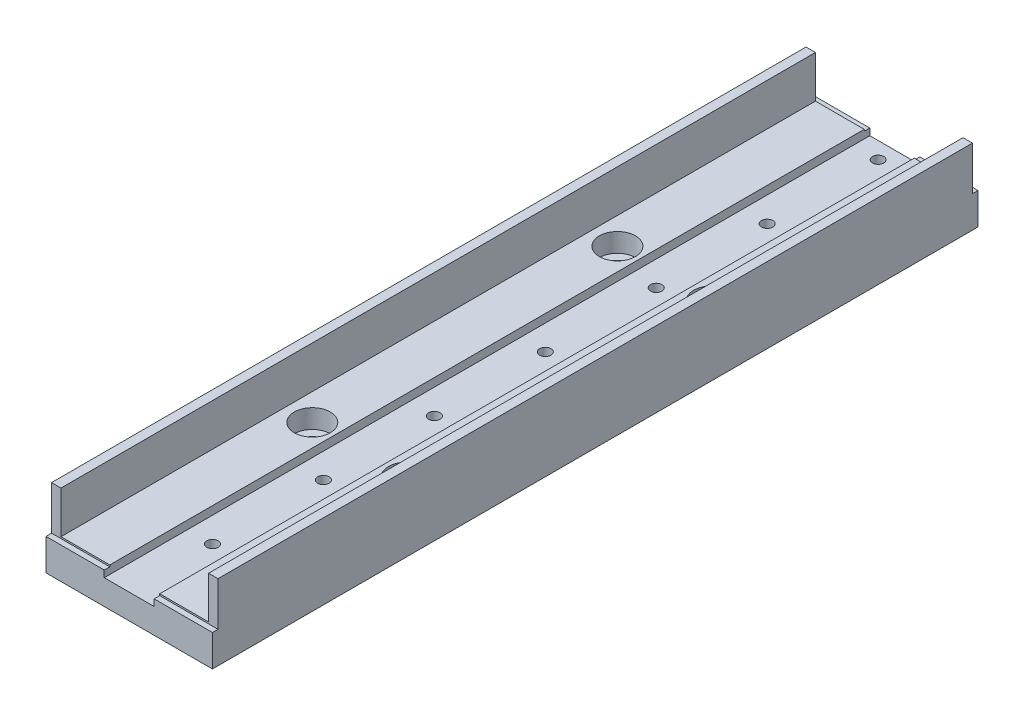
ISO-10303-21;
HEADER;
FILE_DESCRIPTION(('STEP AP214'),'2;1');
FILE_NAME('part.step','',(''),(''),'','','');
FILE_SCHEMA(('AUTOMOTIVE_DESIGN { 1 0 10303 214 1 1 1 1 }'));
ENDSEC;
DATA;
#1=APPLICATION_CONTEXT('core data for automotive mechanical design processes');
#2=APPLICATION_PROTOCOL_DEFINITION('international standard','automotive_design',2000,#1);
#3=PRODUCT_CONTEXT('',#1,'mechanical');
#4=PRODUCT('Part','Part','',(#3));
#5=PRODUCT_RELATED_PRODUCT_CATEGORY('part','',(#4));
#6=PRODUCT_DEFINITION_FORMATION('','',#4);
#7=PRODUCT_DEFINITION_CONTEXT('part definition',#1,'design');
#8=PRODUCT_DEFINITION('design','',#6,#7);
#9=PRODUCT_DEFINITION_SHAPE('','',#8);
#10=(LENGTH_UNIT() NAMED_UNIT(*) SI_UNIT(.MILLI.,.METRE.));
#11=(NAMED_UNIT(*) PLANE_ANGLE_UNIT() SI_UNIT($,.RADIAN.));
#12=(NAMED_UNIT(*) SI_UNIT($,.STERADIAN.) SOLID_ANGLE_UNIT());
#13=UNCERTAINTY_MEASURE_WITH_UNIT(LENGTH_MEASURE(1.E-05),#10,'distance_accuracy_value','');
#14=(GEOMETRIC_REPRESENTATION_CONTEXT(3) GLOBAL_UNCERTAINTY_ASSIGNED_CONTEXT((#13)) GLOBAL_UNIT_ASSIGNED_CONTEXT((#10,
#11,#12)) REPRESENTATION_CONTEXT('',''));
#15=CARTESIAN_POINT('',(0.,0.,0.));
#16=DIRECTION('',(0.,0.,1.));
#17=DIRECTION('',(1.,0.,0.));
#18=AXIS2_PLACEMENT_3D('',#15,#16,#17);
#19=CARTESIAN_POINT('',(-15.,-3.,138.));
#20=DIRECTION('',(0.,1.,0.));
#21=DIRECTION('',(0.,0.,1.));
#22=AXIS2_PLACEMENT_3D('',#19,#20,#21);
#23=PLANE('',#22);
#24=CARTESIAN_POINT('',(-8.50000000000003,-3.,96.5));
#25=DIRECTION('',(0.,1.,0.));
#26=DIRECTION('',(0.,0.,1.));
#27=AXIS2_PLACEMENT_3D('',#24,#25,#26);
#28=CIRCLE('',#27,1.7);
#29=CARTESIAN_POINT('',(-8.50000000000003,-3.,98.2));
#30=VERTEX_POINT('',#29);
#31=EDGE_CURVE('E840',#30,#30,#28,.F.);
#32=ORIENTED_EDGE('',*,*,#31,.F.);
#33=EDGE_LOOP('',(#32));
#34=FACE_BOUND('',#33,.T.);
#35=DIRECTION('',(1.,0.,0.));
#36=VECTOR('',#35,1.);
#37=CARTESIAN_POINT('',(-15.,-3.,0.));
#38=LINE('',#37,#36);
#39=CARTESIAN_POINT('',(-15.,-3.,0.));
#40=VERTEX_POINT('',#39);
#41=CARTESIAN_POINT('',(15.,-3.,0.));
#42=VERTEX_POINT('',#41);
#43=EDGE_CURVE('E226',#40,#42,#38,.T.);
#44=ORIENTED_EDGE('',*,*,#43,.T.);
#45=DIRECTION('',(0.,0.,-1.));
#46=VECTOR('',#45,1.);
#47=CARTESIAN_POINT('',(15.,-3.,138.));
#48=LINE('',#47,#46);
#49=CARTESIAN_POINT('',(15.,-3.,138.));
#50=VERTEX_POINT('',#49);
#51=EDGE_CURVE('E241',#50,#42,#48,.T.);
#52=ORIENTED_EDGE('',*,*,#51,.F.);
#53=DIRECTION('',(1.,0.,0.));
#54=VECTOR('',#53,1.);
#55=CARTESIAN_POINT('',(-15.,-3.,138.));
#56=LINE('',#55,#54);
#57=CARTESIAN_POINT('',(-15.,-3.,138.));
#58=VERTEX_POINT('',#57);
#59=EDGE_CURVE('E216',#58,#50,#56,.T.);
#60=ORIENTED_EDGE('',*,*,#59,.F.);
#61=DIRECTION('',(0.,0.,-1.));
#62=VECTOR('',#61,1.);
#63=CARTESIAN_POINT('',(-15.,-3.,138.));
#64=LINE('',#63,#62);
#65=EDGE_CURVE('E254',#58,#40,#64,.T.);
#66=ORIENTED_EDGE('',*,*,#65,.T.);
#67=EDGE_LOOP('',(#44,#52,#60,#66));
#68=FACE_BOUND('',#67,.T.);
#69=CARTESIAN_POINT('',(-8.50000000000003,-3.,41.5));
#70=DIRECTION('',(0.,1.,0.));
#71=DIRECTION('',(0.,0.,1.));
#72=AXIS2_PLACEMENT_3D('',#69,#70,#71);
#73=CIRCLE('',#72,1.7);
#74=CARTESIAN_POINT('',(-8.50000000000003,-3.,43.2));
#75=VERTEX_POINT('',#74);
#76=EDGE_CURVE('E375',#75,#75,#73,.F.);
#77=ORIENTED_EDGE('',*,*,#76,.F.);
#78=EDGE_LOOP('',(#77));
#79=FACE_BOUND('',#78,.T.);
#80=CARTESIAN_POINT('',(8.49999999999997,-3.,41.5));
#81=DIRECTION('',(0.,1.,0.));
#82=DIRECTION('',(0.,0.,1.));
#83=AXIS2_PLACEMENT_3D('',#80,#81,#82);
#84=CIRCLE('',#83,1.7);
#85=CARTESIAN_POINT('',(8.49999999999997,-3.,43.2));
#86=VERTEX_POINT('',#85);
#87=EDGE_CURVE('E862',#86,#86,#84,.F.);
#88=ORIENTED_EDGE('',*,*,#87,.F.);
#89=EDGE_LOOP('',(#88));
#90=FACE_BOUND('',#89,.T.);
#91=CARTESIAN_POINT('',(8.49999999999997,-3.,96.5));
#92=DIRECTION('',(0.,1.,0.));
#93=DIRECTION('',(0.,0.,1.));
#94=AXIS2_PLACEMENT_3D('',#91,#92,#93);
#95=CIRCLE('',#94,1.7);
#96=CARTESIAN_POINT('',(8.49999999999997,-3.,98.2));
#97=VERTEX_POINT('',#96);
#98=EDGE_CURVE('E849',#97,#97,#95,.F.);
#99=ORIENTED_EDGE('',*,*,#98,.F.);
#100=EDGE_LOOP('',(#99));
#101=FACE_BOUND('',#100,.T.);
#102=CARTESIAN_POINT('',(0.,-3.,123.));
#103=DIRECTION('',(0.,1.,0.));
#104=DIRECTION('',(0.,0.,1.));
#105=AXIS2_PLACEMENT_3D('',#102,#103,#104);
#106=CIRCLE('',#105,1.025);
#107=CARTESIAN_POINT('',(0.,-3.,124.025));
#108=VERTEX_POINT('',#107);
#109=EDGE_CURVE('E831',#108,#108,#106,.F.);
#110=ORIENTED_EDGE('',*,*,#109,.F.);
#111=EDGE_LOOP('',(#110));
#112=FACE_BOUND('',#111,.T.);
#113=CARTESIAN_POINT('',(0.,-3.,103.));
#114=DIRECTION('',(0.,1.,0.));
#115=DIRECTION('',(0.,0.,1.));
#116=AXIS2_PLACEMENT_3D('',#113,#114,#115);
#117=CIRCLE('',#116,1.025);
#118=CARTESIAN_POINT('',(0.,-3.,104.025));
#119=VERTEX_POINT('',#118);
#120=EDGE_CURVE('E824',#119,#119,#117,.F.);
#121=ORIENTED_EDGE('',*,*,#120,.F.);
#122=EDGE_LOOP('',(#121));
#123=FACE_BOUND('',#122,.T.);
#124=CARTESIAN_POINT('',(0.,-3.,83.));
#125=DIRECTION('',(0.,1.,0.));
#126=DIRECTION('',(0.,0.,1.));
#127=AXIS2_PLACEMENT_3D('',#124,#125,#126);
#128=CIRCLE('',#127,1.025);
#129=CARTESIAN_POINT('',(0.,-3.,84.025));
#130=VERTEX_POINT('',#129);
#131=EDGE_CURVE('E819',#130,#130,#128,.F.);
#132=ORIENTED_EDGE('',*,*,#131,.F.);
#133=EDGE_LOOP('',(#132));
#134=FACE_BOUND('',#133,.T.);
#135=CARTESIAN_POINT('',(0.,-3.,63.));
#136=DIRECTION('',(0.,1.,0.));
#137=DIRECTION('',(0.,0.,1.));
#138=AXIS2_PLACEMENT_3D('',#135,#136,#137);
#139=CIRCLE('',#138,1.025);
#140=CARTESIAN_POINT('',(0.,-3.,64.025));
#141=VERTEX_POINT('',#140);
#142=EDGE_CURVE('E811',#141,#141,#139,.F.);
#143=ORIENTED_EDGE('',*,*,#142,.F.);
#144=EDGE_LOOP('',(#143));
#145=FACE_BOUND('',#144,.T.);
#146=CARTESIAN_POINT('',(0.,-3.,43.));
#147=DIRECTION('',(0.,1.,0.));
#148=DIRECTION('',(0.,0.,1.));
#149=AXIS2_PLACEMENT_3D('',#146,#147,#148);
#150=CIRCLE('',#149,1.025);
#151=CARTESIAN_POINT('',(0.,-3.,44.025));
#152=VERTEX_POINT('',#151);
#153=EDGE_CURVE('E809',#152,#152,#150,.F.);
#154=ORIENTED_EDGE('',*,*,#153,.F.);
#155=EDGE_LOOP('',(#154));
#156=FACE_BOUND('',#155,.T.);
#157=CARTESIAN_POINT('',(0.,-3.,23.));
#158=DIRECTION('',(0.,1.,0.));
#159=DIRECTION('',(0.,0.,1.));
#160=AXIS2_PLACEMENT_3D('',#157,#158,#159);
#161=CIRCLE('',#160,1.025);
#162=CARTESIAN_POINT('',(0.,-3.,24.025));
#163=VERTEX_POINT('',#162);
#164=EDGE_CURVE('E802',#163,#163,#161,.F.);
#165=ORIENTED_EDGE('',*,*,#164,.F.);
#166=EDGE_LOOP('',(#165));
#167=FACE_BOUND('',#166,.T.);
#168=CARTESIAN_POINT('',(0.,-3.,3.00000000000002));
#169=DIRECTION('',(0.,1.,0.));
#170=DIRECTION('',(0.,0.,1.));
#171=AXIS2_PLACEMENT_3D('',#168,#169,#170);
#172=CIRCLE('',#171,1.025);
#173=CARTESIAN_POINT('',(0.,-3.,4.02500000000001));
#174=VERTEX_POINT('',#173);
#175=EDGE_CURVE('E791',#174,#174,#172,.F.);
#176=ORIENTED_EDGE('',*,*,#175,.F.);
#177=EDGE_LOOP('',(#176));
#178=FACE_BOUND('',#177,.T.);
#179=ADVANCED_FACE('F70',(#34,#68,#79,#90,#101,#112,#123,#134,#145,#156,#167,#178),#23,.F.);
#180=CARTESIAN_POINT('',(-4.5,1.5,138.));
#181=DIRECTION('',(0.,-1.,0.));
#182=DIRECTION('',(1.,0.,0.));
#183=AXIS2_PLACEMENT_3D('',#180,#181,#182);
#184=PLANE('',#183);
#185=CARTESIAN_POINT('',(0.,1.5,3.00000000000002));
#186=DIRECTION('',(0.,1.,0.));
#187=DIRECTION('',(0.,0.,1.));
#188=AXIS2_PLACEMENT_3D('',#185,#186,#187);
#189=CIRCLE('',#188,1.025);
#190=CARTESIAN_POINT('',(0.,1.5,4.02500000000002));
#191=VERTEX_POINT('',#190);
#192=EDGE_CURVE('E797',#191,#191,#189,.T.);
#193=ORIENTED_EDGE('',*,*,#192,.F.);
#194=EDGE_LOOP('',(#193));
#195=FACE_BOUND('',#194,.T.);
#196=CARTESIAN_POINT('',(0.,1.5,23.));
#197=DIRECTION('',(0.,1.,0.));
#198=DIRECTION('',(0.,0.,1.));
#199=AXIS2_PLACEMENT_3D('',#196,#197,#198);
#200=CIRCLE('',#199,1.025);
#201=CARTESIAN_POINT('',(0.,1.5,24.025));
#202=VERTEX_POINT('',#201);
#203=EDGE_CURVE('E799',#202,#202,#200,.T.);
#204=ORIENTED_EDGE('',*,*,#203,.F.);
#205=EDGE_LOOP('',(#204));
#206=FACE_BOUND('',#205,.T.);
#207=CARTESIAN_POINT('',(0.,1.5,43.));
#208=DIRECTION('',(0.,1.,0.));
#209=DIRECTION('',(0.,0.,1.));
#210=AXIS2_PLACEMENT_3D('',#207,#208,#209);
#211=CIRCLE('',#210,1.025);
#212=CARTESIAN_POINT('',(0.,1.5,44.025));
#213=VERTEX_POINT('',#212);
#214=EDGE_CURVE('E804',#213,#213,#211,.T.);
#215=ORIENTED_EDGE('',*,*,#214,.F.);
#216=EDGE_LOOP('',(#215));
#217=FACE_BOUND('',#216,.T.);
#218=CARTESIAN_POINT('',(0.,1.5,63.));
#219=DIRECTION('',(0.,1.,0.));
#220=DIRECTION('',(0.,0.,1.));
#221=AXIS2_PLACEMENT_3D('',#218,#219,#220);
#222=CIRCLE('',#221,1.025);
#223=CARTESIAN_POINT('',(0.,1.5,64.025));
#224=VERTEX_POINT('',#223);
#225=EDGE_CURVE('E808',#224,#224,#222,.T.);
#226=ORIENTED_EDGE('',*,*,#225,.F.);
#227=EDGE_LOOP('',(#226));
#228=FACE_BOUND('',#227,.T.);
#229=CARTESIAN_POINT('',(0.,1.5,83.));
#230=DIRECTION('',(0.,1.,0.));
#231=DIRECTION('',(0.,0.,1.));
#232=AXIS2_PLACEMENT_3D('',#229,#230,#231);
#233=CIRCLE('',#232,1.025);
#234=CARTESIAN_POINT('',(0.,1.5,84.025));
#235=VERTEX_POINT('',#234);
#236=EDGE_CURVE('E818',#235,#235,#233,.T.);
#237=ORIENTED_EDGE('',*,*,#236,.F.);
#238=EDGE_LOOP('',(#237));
#239=FACE_BOUND('',#238,.T.);
#240=CARTESIAN_POINT('',(0.,1.5,123.));
#241=DIRECTION('',(0.,1.,0.));
#242=DIRECTION('',(0.,0.,1.));
#243=AXIS2_PLACEMENT_3D('',#240,#241,#242);
#244=CIRCLE('',#243,1.025);
#245=CARTESIAN_POINT('',(0.,1.5,124.025));
#246=VERTEX_POINT('',#245);
#247=EDGE_CURVE('E828',#246,#246,#244,.T.);
#248=ORIENTED_EDGE('',*,*,#247,.F.);
#249=EDGE_LOOP('',(#248));
#250=FACE_BOUND('',#249,.T.);
#251=DIRECTION('',(-1.,0.,0.));
#252=VECTOR('',#251,1.);
#253=CARTESIAN_POINT('',(-4.5,1.5,0.));
#254=LINE('',#253,#252);
#255=CARTESIAN_POINT('',(4.5,1.5,0.));
#256=VERTEX_POINT('',#255);
#257=CARTESIAN_POINT('',(-4.5,1.5,0.));
#258=VERTEX_POINT('',#257);
#259=EDGE_CURVE('E242',#256,#258,#254,.T.);
#260=ORIENTED_EDGE('',*,*,#259,.T.);
#261=DIRECTION('',(0.,0.,-1.));
#262=VECTOR('',#261,1.);
#263=CARTESIAN_POINT('',(-4.5,1.5,138.));
#264=LINE('',#263,#262);
#265=CARTESIAN_POINT('',(-4.5,1.5,138.));
#266=VERTEX_POINT('',#265);
#267=EDGE_CURVE('E270',#266,#258,#264,.T.);
#268=ORIENTED_EDGE('',*,*,#267,.F.);
#269=DIRECTION('',(-1.,0.,0.));
#270=VECTOR('',#269,1.);
#271=CARTESIAN_POINT('',(-4.5,1.5,138.));
#272=LINE('',#271,#270);
#273=CARTESIAN_POINT('',(4.5,1.5,138.));
#274=VERTEX_POINT('',#273);
#275=EDGE_CURVE('E223',#274,#266,#272,.T.);
#276=ORIENTED_EDGE('',*,*,#275,.F.);
#277=DIRECTION('',(0.,0.,-1.));
#278=VECTOR('',#277,1.);
#279=CARTESIAN_POINT('',(4.5,1.5,138.));
#280=LINE('',#279,#278);
#281=EDGE_CURVE('E272',#274,#256,#280,.T.);
#282=ORIENTED_EDGE('',*,*,#281,.T.);
#283=EDGE_LOOP('',(#260,#268,#276,#282));
#284=FACE_BOUND('',#283,.T.);
#285=CARTESIAN_POINT('',(0.,1.5,103.));
#286=DIRECTION('',(0.,1.,0.));
#287=DIRECTION('',(0.,0.,1.));
#288=AXIS2_PLACEMENT_3D('',#285,#286,#287);
#289=CIRCLE('',#288,1.025);
#290=CARTESIAN_POINT('',(0.,1.5,104.025));
#291=VERTEX_POINT('',#290);
#292=EDGE_CURVE('E825',#291,#291,#289,.T.);
#293=ORIENTED_EDGE('',*,*,#292,.F.);
#294=EDGE_LOOP('',(#293));
#295=FACE_BOUND('',#294,.T.);
#296=ADVANCED_FACE('F306',(#195,#206,#217,#228,#239,#250,#284,#295),#184,.F.);
#297=CARTESIAN_POINT('',(15.,10.6,138.));
#298=DIRECTION('',(0.,-1.,0.));
#299=DIRECTION('',(0.,0.,-1.));
#300=AXIS2_PLACEMENT_3D('',#297,#298,#299);
#301=PLANE('',#300);
#302=DIRECTION('',(0.,0.,-1.));
#303=VECTOR('',#302,1.);
#304=CARTESIAN_POINT('',(13.3,10.6,138.));
#305=LINE('',#304,#303);
#306=CARTESIAN_POINT('',(13.3,10.6,137.));
#307=VERTEX_POINT('',#306);
#308=CARTESIAN_POINT('',(13.3,10.6,1.));
#309=VERTEX_POINT('',#308);
#310=EDGE_CURVE('E278',#307,#309,#305,.T.);
#311=ORIENTED_EDGE('',*,*,#310,.F.);
#312=DIRECTION('',(-1.,0.,0.));
#313=VECTOR('',#312,1.);
#314=CARTESIAN_POINT('',(-15.,10.6,137.));
#315=LINE('',#314,#313);
#316=CARTESIAN_POINT('',(15.,10.6,137.));
#317=VERTEX_POINT('',#316);
#318=EDGE_CURVE('E366',#317,#307,#315,.T.);
#319=ORIENTED_EDGE('',*,*,#318,.F.);
#320=DIRECTION('',(0.,0.,-1.));
#321=VECTOR('',#320,1.);
#322=CARTESIAN_POINT('',(15.,10.6,138.));
#323=LINE('',#322,#321);
#324=CARTESIAN_POINT('',(14.9999999999999,10.6,1.));
#325=VERTEX_POINT('',#324);
#326=EDGE_CURVE('E283',#317,#325,#323,.T.);
#327=ORIENTED_EDGE('',*,*,#326,.T.);
#328=DIRECTION('',(1.,0.,0.));
#329=VECTOR('',#328,1.);
#330=CARTESIAN_POINT('',(-15.,10.6,1.));
#331=LINE('',#330,#329);
#332=EDGE_CURVE('E370',#309,#325,#331,.T.);
#333=ORIENTED_EDGE('',*,*,#332,.F.);
#334=EDGE_LOOP('',(#311,#319,#327,#333));
#335=FACE_BOUND('',#334,.T.);
#336=ADVANCED_FACE('F69',(#335),#301,.F.);
#337=CARTESIAN_POINT('',(13.3,3.00000000000009,138.));
#338=DIRECTION('',(1.,0.,0.));
#339=DIRECTION('',(0.,1.,0.));
#340=AXIS2_PLACEMENT_3D('',#337,#338,#339);
#341=PLANE('',#340);
#342=DIRECTION('',(0.,0.,-1.));
#343=VECTOR('',#342,1.);
#344=CARTESIAN_POINT('',(13.3,3.00000000000009,138.));
#345=LINE('',#344,#343);
#346=CARTESIAN_POINT('',(13.3,3.00000000000009,137.));
#347=VERTEX_POINT('',#346);
#348=CARTESIAN_POINT('',(13.3,3.00000000000009,1.));
#349=VERTEX_POINT('',#348);
#350=EDGE_CURVE('E280',#347,#349,#345,.T.);
#351=ORIENTED_EDGE('',*,*,#350,.F.);
#352=DIRECTION('',(0.,1.,0.));
#353=VECTOR('',#352,1.);
#354=CARTESIAN_POINT('',(13.3,3.00000000000009,137.));
#355=LINE('',#354,#353);
#356=EDGE_CURVE('E233',#347,#307,#355,.T.);
#357=ORIENTED_EDGE('',*,*,#356,.T.);
#358=ORIENTED_EDGE('',*,*,#310,.T.);
#359=DIRECTION('',(0.,-1.,0.));
#360=VECTOR('',#359,1.);
#361=CARTESIAN_POINT('',(13.3,3.00000000000009,1.));
#362=LINE('',#361,#360);
#363=EDGE_CURVE('E338',#309,#349,#362,.T.);
#364=ORIENTED_EDGE('',*,*,#363,.T.);
#365=EDGE_LOOP('',(#351,#357,#358,#364));
#366=FACE_BOUND('',#365,.T.);
#367=ADVANCED_FACE('F363',(#366),#341,.F.);
#368=CARTESIAN_POINT('',(4.5,3.,138.));
#369=DIRECTION('',(0.,-1.,0.));
#370=DIRECTION('',(1.,0.,0.));
#371=AXIS2_PLACEMENT_3D('',#368,#369,#370);
#372=PLANE('',#371);
#373=CARTESIAN_POINT('',(8.49999999999997,3.00000000000004,96.5));
#374=DIRECTION('',(0.,1.,0.));
#375=DIRECTION('',(0.,0.,1.));
#376=AXIS2_PLACEMENT_3D('',#373,#374,#375);
#377=CIRCLE('',#376,3.25);
#378=CARTESIAN_POINT('',(8.49999999999997,3.00000000000004,99.75));
#379=VERTEX_POINT('',#378);
#380=EDGE_CURVE('E838',#379,#379,#377,.T.);
#381=ORIENTED_EDGE('',*,*,#380,.F.);
#382=EDGE_LOOP('',(#381));
#383=FACE_BOUND('',#382,.T.);
#384=CARTESIAN_POINT('',(8.49999999999997,3.00000000000004,41.5));
#385=DIRECTION('',(0.,1.,0.));
#386=DIRECTION('',(0.,0.,1.));
#387=AXIS2_PLACEMENT_3D('',#384,#385,#386);
#388=CIRCLE('',#387,3.25);
#389=CARTESIAN_POINT('',(8.49999999999997,3.00000000000004,44.75));
#390=VERTEX_POINT('',#389);
#391=EDGE_CURVE('E854',#390,#390,#388,.T.);
#392=ORIENTED_EDGE('',*,*,#391,.F.);
#393=EDGE_LOOP('',(#392));
#394=FACE_BOUND('',#393,.T.);
#395=DIRECTION('',(0.,0.,-1.));
#396=VECTOR('',#395,1.);
#397=CARTESIAN_POINT('',(4.5,3.,138.));
#398=LINE('',#397,#396);
#399=CARTESIAN_POINT('',(4.5,3.,137.));
#400=VERTEX_POINT('',#399);
#401=CARTESIAN_POINT('',(4.5,3.,1.));
#402=VERTEX_POINT('',#401);
#403=EDGE_CURVE('E274',#400,#402,#398,.T.);
#404=ORIENTED_EDGE('',*,*,#403,.F.);
#405=DIRECTION('',(1.,0.,0.));
#406=VECTOR('',#405,1.);
#407=CARTESIAN_POINT('',(4.5,3.,137.));
#408=LINE('',#407,#406);
#409=EDGE_CURVE('E355',#400,#347,#408,.T.);
#410=ORIENTED_EDGE('',*,*,#409,.T.);
#411=ORIENTED_EDGE('',*,*,#350,.T.);
#412=DIRECTION('',(-1.,0.,0.));
#413=VECTOR('',#412,1.);
#414=CARTESIAN_POINT('',(4.5,3.,1.));
#415=LINE('',#414,#413);
#416=EDGE_CURVE('E340',#349,#402,#415,.T.);
#417=ORIENTED_EDGE('',*,*,#416,.T.);
#418=EDGE_LOOP('',(#404,#410,#411,#417));
#419=FACE_BOUND('',#418,.T.);
#420=ADVANCED_FACE('F431',(#383,#394,#419),#372,.F.);
#421=CARTESIAN_POINT('',(4.5,1.5,138.));
#422=DIRECTION('',(1.,0.,0.));
#423=DIRECTION('',(0.,1.,0.));
#424=AXIS2_PLACEMENT_3D('',#421,#422,#423);
#425=PLANE('',#424);
#426=DIRECTION('',(0.,-1.,0.));
#427=VECTOR('',#426,1.);
#428=CARTESIAN_POINT('',(4.5,1.5,138.));
#429=LINE('',#428,#427);
#430=CARTESIAN_POINT('',(4.5,2.7,138.));
#431=VERTEX_POINT('',#430);
#432=EDGE_CURVE('E224',#431,#274,#429,.T.);
#433=ORIENTED_EDGE('',*,*,#432,.F.);
#434=DIRECTION('',(0.,0.,-1.));
#435=VECTOR('',#434,1.);
#436=CARTESIAN_POINT('',(4.5,2.7,138.));
#437=LINE('',#436,#435);
#438=CARTESIAN_POINT('',(4.5,2.7,137.));
#439=VERTEX_POINT('',#438);
#440=EDGE_CURVE('E89',#431,#439,#437,.T.);
#441=ORIENTED_EDGE('',*,*,#440,.T.);
#442=DIRECTION('',(0.,1.,0.));
#443=VECTOR('',#442,1.);
#444=CARTESIAN_POINT('',(4.5,1.5,137.));
#445=LINE('',#444,#443);
#446=EDGE_CURVE('E352',#439,#400,#445,.T.);
#447=ORIENTED_EDGE('',*,*,#446,.T.);
#448=ORIENTED_EDGE('',*,*,#403,.T.);
#449=DIRECTION('',(0.,-1.,0.));
#450=VECTOR('',#449,1.);
#451=CARTESIAN_POINT('',(4.5,1.5,1.));
#452=LINE('',#451,#450);
#453=CARTESIAN_POINT('',(4.5,2.7,1.));
#454=VERTEX_POINT('',#453);
#455=EDGE_CURVE('E319',#402,#454,#452,.T.);
#456=ORIENTED_EDGE('',*,*,#455,.T.);
#457=DIRECTION('',(0.,0.,-1.));
#458=VECTOR('',#457,1.);
#459=CARTESIAN_POINT('',(4.5,2.7,138.));
#460=LINE('',#459,#458);
#461=CARTESIAN_POINT('',(4.5,2.7,0.));
#462=VERTEX_POINT('',#461);
#463=EDGE_CURVE('E320',#454,#462,#460,.T.);
#464=ORIENTED_EDGE('',*,*,#463,.T.);
#465=DIRECTION('',(0.,-1.,0.));
#466=VECTOR('',#465,1.);
#467=CARTESIAN_POINT('',(4.5,1.5,0.));
#468=LINE('',#467,#466);
#469=EDGE_CURVE('E245',#462,#256,#468,.T.);
#470=ORIENTED_EDGE('',*,*,#469,.T.);
#471=ORIENTED_EDGE('',*,*,#281,.F.);
#472=EDGE_LOOP('',(#433,#441,#447,#448,#456,#464,#470,#471));
#473=FACE_BOUND('',#472,.T.);
#474=ADVANCED_FACE('F314',(#473),#425,.F.);
#475=CARTESIAN_POINT('',(-4.5,3.,138.));
#476=DIRECTION('',(-1.,0.,0.));
#477=DIRECTION('',(0.,0.,1.));
#478=AXIS2_PLACEMENT_3D('',#475,#476,#477);
#479=PLANE('',#478);
#480=DIRECTION('',(0.,-1.,0.));
#481=VECTOR('',#480,1.);
#482=CARTESIAN_POINT('',(-4.5,3.,137.));
#483=LINE('',#482,#481);
#484=CARTESIAN_POINT('',(-4.5,3.,137.));
#485=VERTEX_POINT('',#484);
#486=CARTESIAN_POINT('',(-4.5,2.7,137.));
#487=VERTEX_POINT('',#486);
#488=EDGE_CURVE('E349',#485,#487,#483,.T.);
#489=ORIENTED_EDGE('',*,*,#488,.T.);
#490=DIRECTION('',(0.,0.,1.));
#491=VECTOR('',#490,1.);
#492=CARTESIAN_POINT('',(-4.5,2.7,138.));
#493=LINE('',#492,#491);
#494=CARTESIAN_POINT('',(-4.5,2.7,138.));
#495=VERTEX_POINT('',#494);
#496=EDGE_CURVE('E322',#487,#495,#493,.T.);
#497=ORIENTED_EDGE('',*,*,#496,.T.);
#498=DIRECTION('',(0.,1.,0.));
#499=VECTOR('',#498,1.);
#500=CARTESIAN_POINT('',(-4.5,3.,138.));
#501=LINE('',#500,#499);
#502=EDGE_CURVE('E232',#266,#495,#501,.T.);
#503=ORIENTED_EDGE('',*,*,#502,.F.);
#504=ORIENTED_EDGE('',*,*,#267,.T.);
#505=DIRECTION('',(0.,1.,0.));
#506=VECTOR('',#505,1.);
#507=CARTESIAN_POINT('',(-4.5,3.,0.));
#508=LINE('',#507,#506);
#509=CARTESIAN_POINT('',(-4.5,2.7,0.));
#510=VERTEX_POINT('',#509);
#511=EDGE_CURVE('E246',#258,#510,#508,.T.);
#512=ORIENTED_EDGE('',*,*,#511,.T.);
#513=DIRECTION('',(0.,0.,1.));
#514=VECTOR('',#513,1.);
#515=CARTESIAN_POINT('',(-4.5,2.7,138.));
#516=LINE('',#515,#514);
#517=CARTESIAN_POINT('',(-4.5,2.7,1.));
#518=VERTEX_POINT('',#517);
#519=EDGE_CURVE('E297',#510,#518,#516,.T.);
#520=ORIENTED_EDGE('',*,*,#519,.T.);
#521=DIRECTION('',(0.,1.,0.));
#522=VECTOR('',#521,1.);
#523=CARTESIAN_POINT('',(-4.5,3.,1.));
#524=LINE('',#523,#522);
#525=CARTESIAN_POINT('',(-4.5,3.,1.));
#526=VERTEX_POINT('',#525);
#527=EDGE_CURVE('E331',#518,#526,#524,.T.);
#528=ORIENTED_EDGE('',*,*,#527,.T.);
#529=DIRECTION('',(0.,0.,-1.));
#530=VECTOR('',#529,1.);
#531=CARTESIAN_POINT('',(-4.5,3.,138.));
#532=LINE('',#531,#530);
#533=EDGE_CURVE('E261',#485,#526,#532,.T.);
#534=ORIENTED_EDGE('',*,*,#533,.F.);
#535=EDGE_LOOP('',(#489,#497,#503,#504,#512,#520,#528,#534));
#536=FACE_BOUND('',#535,.T.);
#537=ADVANCED_FACE('F296',(#536),#479,.F.);
#538=CARTESIAN_POINT('',(-13.3,3.,138.));
#539=DIRECTION('',(0.,-1.,0.));
#540=DIRECTION('',(0.,0.,-1.));
#541=AXIS2_PLACEMENT_3D('',#538,#539,#540);
#542=PLANE('',#541);
#543=CARTESIAN_POINT('',(-8.50000000000003,2.99999999999986,96.5));
#544=DIRECTION('',(0.,1.,0.));
#545=DIRECTION('',(0.,0.,1.));
#546=AXIS2_PLACEMENT_3D('',#543,#544,#545);
#547=CIRCLE('',#546,3.25);
#548=CARTESIAN_POINT('',(-8.50000000000003,2.99999999999986,99.75));
#549=VERTEX_POINT('',#548);
#550=EDGE_CURVE('E833',#549,#549,#547,.T.);
#551=ORIENTED_EDGE('',*,*,#550,.F.);
#552=EDGE_LOOP('',(#551));
#553=FACE_BOUND('',#552,.T.);
#554=CARTESIAN_POINT('',(-8.50000000000003,2.99999999999986,41.5));
#555=DIRECTION('',(0.,1.,0.));
#556=DIRECTION('',(0.,0.,1.));
#557=AXIS2_PLACEMENT_3D('',#554,#555,#556);
#558=CIRCLE('',#557,3.25);
#559=CARTESIAN_POINT('',(-8.50000000000003,2.99999999999986,44.75));
#560=VERTEX_POINT('',#559);
#561=EDGE_CURVE('E861',#560,#560,#558,.T.);
#562=ORIENTED_EDGE('',*,*,#561,.F.);
#563=EDGE_LOOP('',(#562));
#564=FACE_BOUND('',#563,.T.);
#565=DIRECTION('',(0.,0.,-1.));
#566=VECTOR('',#565,1.);
#567=CARTESIAN_POINT('',(-13.3,3.,138.));
#568=LINE('',#567,#566);
#569=CARTESIAN_POINT('',(-13.3,3.,137.));
#570=VERTEX_POINT('',#569);
#571=CARTESIAN_POINT('',(-13.3,3.,1.));
#572=VERTEX_POINT('',#571);
#573=EDGE_CURVE('E265',#570,#572,#568,.T.);
#574=ORIENTED_EDGE('',*,*,#573,.F.);
#575=DIRECTION('',(1.,0.,0.));
#576=VECTOR('',#575,1.);
#577=CARTESIAN_POINT('',(-13.3,3.,137.));
#578=LINE('',#577,#576);
#579=EDGE_CURVE('E347',#570,#485,#578,.T.);
#580=ORIENTED_EDGE('',*,*,#579,.T.);
#581=ORIENTED_EDGE('',*,*,#533,.T.);
#582=DIRECTION('',(-1.,0.,0.));
#583=VECTOR('',#582,1.);
#584=CARTESIAN_POINT('',(-13.3,3.,1.));
#585=LINE('',#584,#583);
#586=EDGE_CURVE('E332',#526,#572,#585,.T.);
#587=ORIENTED_EDGE('',*,*,#586,.T.);
#588=EDGE_LOOP('',(#574,#580,#581,#587));
#589=FACE_BOUND('',#588,.T.);
#590=ADVANCED_FACE('F406',(#553,#564,#589),#542,.F.);
#591=CARTESIAN_POINT('',(-13.3,3.,138.));
#592=DIRECTION('',(-1.,0.,0.));
#593=DIRECTION('',(0.,0.,1.));
#594=AXIS2_PLACEMENT_3D('',#591,#592,#593);
#595=PLANE('',#594);
#596=DIRECTION('',(0.,0.,-1.));
#597=VECTOR('',#596,1.);
#598=CARTESIAN_POINT('',(-13.3,10.6,138.));
#599=LINE('',#598,#597);
#600=CARTESIAN_POINT('',(-13.3,10.6,137.));
#601=VERTEX_POINT('',#600);
#602=CARTESIAN_POINT('',(-13.3,10.6,1.));
#603=VERTEX_POINT('',#602);
#604=EDGE_CURVE('E256',#601,#603,#599,.T.);
#605=ORIENTED_EDGE('',*,*,#604,.F.);
#606=DIRECTION('',(0.,-1.,0.));
#607=VECTOR('',#606,1.);
#608=CARTESIAN_POINT('',(-13.3,3.,137.));
#609=LINE('',#608,#607);
#610=EDGE_CURVE('E344',#601,#570,#609,.T.);
#611=ORIENTED_EDGE('',*,*,#610,.T.);
#612=ORIENTED_EDGE('',*,*,#573,.T.);
#613=DIRECTION('',(0.,1.,0.));
#614=VECTOR('',#613,1.);
#615=CARTESIAN_POINT('',(-13.3,3.,1.));
#616=LINE('',#615,#614);
#617=EDGE_CURVE('E328',#572,#603,#616,.T.);
#618=ORIENTED_EDGE('',*,*,#617,.T.);
#619=EDGE_LOOP('',(#605,#611,#612,#618));
#620=FACE_BOUND('',#619,.T.);
#621=ADVANCED_FACE('F417',(#620),#595,.F.);
#622=CARTESIAN_POINT('',(-15.,10.6,138.));
#623=DIRECTION('',(0.,-1.,0.));
#624=DIRECTION('',(0.,0.,-1.));
#625=AXIS2_PLACEMENT_3D('',#622,#623,#624);
#626=PLANE('',#625);
#627=DIRECTION('',(0.,0.,-1.));
#628=VECTOR('',#627,1.);
#629=CARTESIAN_POINT('',(-15.,10.6,138.));
#630=LINE('',#629,#628);
#631=CARTESIAN_POINT('',(-15.,10.6,137.));
#632=VERTEX_POINT('',#631);
#633=CARTESIAN_POINT('',(-15.,10.6,1.));
#634=VERTEX_POINT('',#633);
#635=EDGE_CURVE('E257',#632,#634,#630,.T.);
#636=ORIENTED_EDGE('',*,*,#635,.F.);
#637=EDGE_CURVE('E381',#601,#632,#315,.T.);
#638=ORIENTED_EDGE('',*,*,#637,.F.);
#639=ORIENTED_EDGE('',*,*,#604,.T.);
#640=EDGE_CURVE('E371',#634,#603,#331,.T.);
#641=ORIENTED_EDGE('',*,*,#640,.F.);
#642=EDGE_LOOP('',(#636,#638,#639,#641));
#643=FACE_BOUND('',#642,.T.);
#644=ADVANCED_FACE('F416',(#643),#626,.F.);
#645=CARTESIAN_POINT('',(-15.,-3.,138.));
#646=DIRECTION('',(1.,0.,0.));
#647=DIRECTION('',(0.,0.,-1.));
#648=AXIS2_PLACEMENT_3D('',#645,#646,#647);
#649=PLANE('',#648);
#650=DIRECTION('',(0.,-1.,0.));
#651=VECTOR('',#650,1.);
#652=CARTESIAN_POINT('',(-15.,3.,138.));
#653=LINE('',#652,#651);
#654=CARTESIAN_POINT('',(-15.,2.7,138.));
#655=VERTEX_POINT('',#654);
#656=EDGE_CURVE('E238',#655,#58,#653,.T.);
#657=ORIENTED_EDGE('',*,*,#656,.F.);
#658=DIRECTION('',(0.,0.,1.));
#659=VECTOR('',#658,1.);
#660=CARTESIAN_POINT('',(-15.,2.7,138.));
#661=LINE('',#660,#659);
#662=CARTESIAN_POINT('',(-15.,2.7,137.));
#663=VERTEX_POINT('',#662);
#664=EDGE_CURVE('E85',#663,#655,#661,.T.);
#665=ORIENTED_EDGE('',*,*,#664,.F.);
#666=DIRECTION('',(0.,1.,0.));
#667=VECTOR('',#666,1.);
#668=CARTESIAN_POINT('',(-15.,-27.6166620396073,137.));
#669=LINE('',#668,#667);
#670=EDGE_CURVE('E426',#663,#632,#669,.T.);
#671=ORIENTED_EDGE('',*,*,#670,.T.);
#672=ORIENTED_EDGE('',*,*,#635,.T.);
#673=DIRECTION('',(0.,1.,0.));
#674=VECTOR('',#673,1.);
#675=CARTESIAN_POINT('',(-15.,-27.6166620396073,1.));
#676=LINE('',#675,#674);
#677=CARTESIAN_POINT('',(-15.,2.7,1.));
#678=VERTEX_POINT('',#677);
#679=EDGE_CURVE('E385',#678,#634,#676,.T.);
#680=ORIENTED_EDGE('',*,*,#679,.F.);
#681=DIRECTION('',(0.,0.,1.));
#682=VECTOR('',#681,1.);
#683=CARTESIAN_POINT('',(-15.,2.7,0.));
#684=LINE('',#683,#682);
#685=CARTESIAN_POINT('',(-15.,2.7,0.));
#686=VERTEX_POINT('',#685);
#687=EDGE_CURVE('E372',#686,#678,#684,.T.);
#688=ORIENTED_EDGE('',*,*,#687,.F.);
#689=DIRECTION('',(0.,-1.,0.));
#690=VECTOR('',#689,1.);
#691=CARTESIAN_POINT('',(-15.,-3.,0.));
#692=LINE('',#691,#690);
#693=EDGE_CURVE('E248',#686,#40,#692,.T.);
#694=ORIENTED_EDGE('',*,*,#693,.T.);
#695=ORIENTED_EDGE('',*,*,#65,.F.);
#696=EDGE_LOOP('',(#657,#665,#671,#672,#680,#688,#694,#695));
#697=FACE_BOUND('',#696,.T.);
#698=ADVANCED_FACE('F401',(#697),#649,.F.);
#699=CARTESIAN_POINT('',(15.,-3.,138.));
#700=DIRECTION('',(-1.,0.,0.));
#701=DIRECTION('',(0.,0.,1.));
#702=AXIS2_PLACEMENT_3D('',#699,#700,#701);
#703=PLANE('',#702);
#704=DIRECTION('',(0.,1.,0.));
#705=VECTOR('',#704,1.);
#706=CARTESIAN_POINT('',(15.,-27.6166620396073,137.));
#707=LINE('',#706,#705);
#708=CARTESIAN_POINT('',(15.,2.7,137.));
#709=VERTEX_POINT('',#708);
#710=EDGE_CURVE('E213',#709,#317,#707,.T.);
#711=ORIENTED_EDGE('',*,*,#710,.F.);
#712=DIRECTION('',(0.,0.,-1.));
#713=VECTOR('',#712,1.);
#714=CARTESIAN_POINT('',(15.,2.7,138.));
#715=LINE('',#714,#713);
#716=CARTESIAN_POINT('',(15.,2.7,138.));
#717=VERTEX_POINT('',#716);
#718=EDGE_CURVE('E201',#717,#709,#715,.T.);
#719=ORIENTED_EDGE('',*,*,#718,.F.);
#720=DIRECTION('',(0.,1.,0.));
#721=VECTOR('',#720,1.);
#722=CARTESIAN_POINT('',(15.,3.,138.));
#723=LINE('',#722,#721);
#724=EDGE_CURVE('E215',#50,#717,#723,.T.);
#725=ORIENTED_EDGE('',*,*,#724,.F.);
#726=ORIENTED_EDGE('',*,*,#51,.T.);
#727=DIRECTION('',(0.,1.,0.));
#728=VECTOR('',#727,1.);
#729=CARTESIAN_POINT('',(15.,-3.,0.));
#730=LINE('',#729,#728);
#731=CARTESIAN_POINT('',(15.,2.7,0.));
#732=VERTEX_POINT('',#731);
#733=EDGE_CURVE('E225',#42,#732,#730,.T.);
#734=ORIENTED_EDGE('',*,*,#733,.T.);
#735=DIRECTION('',(0.,0.,-1.));
#736=VECTOR('',#735,1.);
#737=CARTESIAN_POINT('',(14.9999999999999,2.7,0.));
#738=LINE('',#737,#736);
#739=CARTESIAN_POINT('',(14.9999999999999,2.7,1.));
#740=VERTEX_POINT('',#739);
#741=EDGE_CURVE('E383',#740,#732,#738,.T.);
#742=ORIENTED_EDGE('',*,*,#741,.F.);
#743=DIRECTION('',(0.,1.,0.));
#744=VECTOR('',#743,1.);
#745=CARTESIAN_POINT('',(14.9999999999999,-27.6166620396073,1.));
#746=LINE('',#745,#744);
#747=EDGE_CURVE('E390',#740,#325,#746,.T.);
#748=ORIENTED_EDGE('',*,*,#747,.T.);
#749=ORIENTED_EDGE('',*,*,#326,.F.);
#750=EDGE_LOOP('',(#711,#719,#725,#726,#734,#742,#748,#749));
#751=FACE_BOUND('',#750,.T.);
#752=ADVANCED_FACE('F208',(#751),#703,.F.);
#753=CARTESIAN_POINT('',(0.,0.,138.));
#754=DIRECTION('',(0.,0.,1.));
#755=DIRECTION('',(1.,0.,0.));
#756=AXIS2_PLACEMENT_3D('',#753,#754,#755);
#757=PLANE('',#756);
#758=DIRECTION('',(1.,0.,0.));
#759=VECTOR('',#758,1.);
#760=CARTESIAN_POINT('',(-15.,2.7,138.));
#761=LINE('',#760,#759);
#762=EDGE_CURVE('E217',#655,#495,#761,.T.);
#763=ORIENTED_EDGE('',*,*,#762,.F.);
#764=ORIENTED_EDGE('',*,*,#656,.T.);
#765=ORIENTED_EDGE('',*,*,#59,.T.);
#766=ORIENTED_EDGE('',*,*,#724,.T.);
#767=DIRECTION('',(1.,0.,0.));
#768=VECTOR('',#767,1.);
#769=CARTESIAN_POINT('',(0.,2.7,138.));
#770=LINE('',#769,#768);
#771=EDGE_CURVE('E14',#431,#717,#770,.T.);
#772=ORIENTED_EDGE('',*,*,#771,.F.);
#773=ORIENTED_EDGE('',*,*,#432,.T.);
#774=ORIENTED_EDGE('',*,*,#275,.T.);
#775=ORIENTED_EDGE('',*,*,#502,.T.);
#776=EDGE_LOOP('',(#763,#764,#765,#766,#772,#773,#774,#775));
#777=FACE_BOUND('',#776,.T.);
#778=ADVANCED_FACE('F218',(#777),#757,.T.);
#779=CARTESIAN_POINT('',(0.,0.,0.));
#780=DIRECTION('',(0.,0.,1.));
#781=DIRECTION('',(1.,0.,0.));
#782=AXIS2_PLACEMENT_3D('',#779,#780,#781);
#783=PLANE('',#782);
#784=ORIENTED_EDGE('',*,*,#693,.F.);
#785=DIRECTION('',(1.,0.,0.));
#786=VECTOR('',#785,1.);
#787=CARTESIAN_POINT('',(0.,2.7,0.));
#788=LINE('',#787,#786);
#789=EDGE_CURVE('E73',#686,#510,#788,.T.);
#790=ORIENTED_EDGE('',*,*,#789,.T.);
#791=ORIENTED_EDGE('',*,*,#511,.F.);
#792=ORIENTED_EDGE('',*,*,#259,.F.);
#793=ORIENTED_EDGE('',*,*,#469,.F.);
#794=DIRECTION('',(-1.,0.,0.));
#795=VECTOR('',#794,1.);
#796=CARTESIAN_POINT('',(-15.,2.7,0.));
#797=LINE('',#796,#795);
#798=EDGE_CURVE('E315',#732,#462,#797,.T.);
#799=ORIENTED_EDGE('',*,*,#798,.F.);
#800=ORIENTED_EDGE('',*,*,#733,.F.);
#801=ORIENTED_EDGE('',*,*,#43,.F.);
#802=EDGE_LOOP('',(#784,#790,#791,#792,#793,#799,#800,#801));
#803=FACE_BOUND('',#802,.T.);
#804=ADVANCED_FACE('F286',(#803),#783,.F.);
#805=CARTESIAN_POINT('',(-13.3,2.7,138.));
#806=DIRECTION('',(0.,-1.,0.));
#807=DIRECTION('',(0.,0.,-1.));
#808=AXIS2_PLACEMENT_3D('',#805,#806,#807);
#809=PLANE('',#808);
#810=DIRECTION('',(1.,0.,0.));
#811=VECTOR('',#810,1.);
#812=CARTESIAN_POINT('',(-15.,2.7,1.));
#813=LINE('',#812,#811);
#814=EDGE_CURVE('E392',#454,#740,#813,.T.);
#815=ORIENTED_EDGE('',*,*,#814,.T.);
#816=ORIENTED_EDGE('',*,*,#741,.T.);
#817=ORIENTED_EDGE('',*,*,#798,.T.);
#818=ORIENTED_EDGE('',*,*,#463,.F.);
#819=EDGE_LOOP('',(#815,#816,#817,#818));
#820=FACE_BOUND('',#819,.T.);
#821=ADVANCED_FACE('F391',(#820),#809,.F.);
#822=CARTESIAN_POINT('',(-15.,-27.6166620396073,1.));
#823=DIRECTION('',(0.,0.,1.));
#824=DIRECTION('',(1.,0.,0.));
#825=AXIS2_PLACEMENT_3D('',#822,#823,#824);
#826=PLANE('',#825);
#827=ORIENTED_EDGE('',*,*,#332,.T.);
#828=ORIENTED_EDGE('',*,*,#747,.F.);
#829=ORIENTED_EDGE('',*,*,#814,.F.);
#830=ORIENTED_EDGE('',*,*,#455,.F.);
#831=ORIENTED_EDGE('',*,*,#416,.F.);
#832=ORIENTED_EDGE('',*,*,#363,.F.);
#833=EDGE_LOOP('',(#827,#828,#829,#830,#831,#832));
#834=FACE_BOUND('',#833,.T.);
#835=ADVANCED_FACE('F399',(#834),#826,.F.);
#836=EDGE_CURVE('E389',#678,#518,#813,.T.);
#837=ORIENTED_EDGE('',*,*,#836,.F.);
#838=ORIENTED_EDGE('',*,*,#679,.T.);
#839=ORIENTED_EDGE('',*,*,#640,.T.);
#840=ORIENTED_EDGE('',*,*,#617,.F.);
#841=ORIENTED_EDGE('',*,*,#586,.F.);
#842=ORIENTED_EDGE('',*,*,#527,.F.);
#843=EDGE_LOOP('',(#837,#838,#839,#840,#841,#842));
#844=FACE_BOUND('',#843,.T.);
#845=ADVANCED_FACE('F403',(#844),#826,.F.);
#846=ORIENTED_EDGE('',*,*,#789,.F.);
#847=ORIENTED_EDGE('',*,*,#687,.T.);
#848=ORIENTED_EDGE('',*,*,#836,.T.);
#849=ORIENTED_EDGE('',*,*,#519,.F.);
#850=EDGE_LOOP('',(#846,#847,#848,#849));
#851=FACE_BOUND('',#850,.T.);
#852=ADVANCED_FACE('F404',(#851),#809,.F.);
#853=CARTESIAN_POINT('',(-13.3,2.7,138.));
#854=DIRECTION('',(0.,-1.,0.));
#855=DIRECTION('',(0.,0.,-1.));
#856=AXIS2_PLACEMENT_3D('',#853,#854,#855);
#857=PLANE('',#856);
#858=ORIENTED_EDGE('',*,*,#771,.T.);
#859=ORIENTED_EDGE('',*,*,#718,.T.);
#860=DIRECTION('',(-1.,0.,0.));
#861=VECTOR('',#860,1.);
#862=CARTESIAN_POINT('',(-15.,2.7,137.));
#863=LINE('',#862,#861);
#864=EDGE_CURVE('E429',#709,#439,#863,.T.);
#865=ORIENTED_EDGE('',*,*,#864,.T.);
#866=ORIENTED_EDGE('',*,*,#440,.F.);
#867=EDGE_LOOP('',(#858,#859,#865,#866));
#868=FACE_BOUND('',#867,.T.);
#869=ADVANCED_FACE('F205',(#868),#857,.F.);
#870=CARTESIAN_POINT('',(-15.,-27.6166620396073,137.));
#871=DIRECTION('',(0.,0.,-1.));
#872=DIRECTION('',(-1.,0.,0.));
#873=AXIS2_PLACEMENT_3D('',#870,#871,#872);
#874=PLANE('',#873);
#875=ORIENTED_EDGE('',*,*,#409,.F.);
#876=ORIENTED_EDGE('',*,*,#446,.F.);
#877=ORIENTED_EDGE('',*,*,#864,.F.);
#878=ORIENTED_EDGE('',*,*,#710,.T.);
#879=ORIENTED_EDGE('',*,*,#318,.T.);
#880=ORIENTED_EDGE('',*,*,#356,.F.);
#881=EDGE_LOOP('',(#875,#876,#877,#878,#879,#880));
#882=FACE_BOUND('',#881,.T.);
#883=ADVANCED_FACE('F539',(#882),#874,.F.);
#884=ORIENTED_EDGE('',*,*,#579,.F.);
#885=ORIENTED_EDGE('',*,*,#610,.F.);
#886=ORIENTED_EDGE('',*,*,#637,.T.);
#887=ORIENTED_EDGE('',*,*,#670,.F.);
#888=EDGE_CURVE('E427',#487,#663,#863,.T.);
#889=ORIENTED_EDGE('',*,*,#888,.F.);
#890=ORIENTED_EDGE('',*,*,#488,.F.);
#891=EDGE_LOOP('',(#884,#885,#886,#887,#889,#890));
#892=FACE_BOUND('',#891,.T.);
#893=ADVANCED_FACE('F412',(#892),#874,.F.);
#894=ORIENTED_EDGE('',*,*,#888,.T.);
#895=ORIENTED_EDGE('',*,*,#664,.T.);
#896=ORIENTED_EDGE('',*,*,#762,.T.);
#897=ORIENTED_EDGE('',*,*,#496,.F.);
#898=EDGE_LOOP('',(#894,#895,#896,#897));
#899=FACE_BOUND('',#898,.T.);
#900=ADVANCED_FACE('F538',(#899),#857,.F.);
#901=CARTESIAN_POINT('',(-8.50000000000003,2.99999999999986,41.5));
#902=DIRECTION('',(0.,1.,0.));
#903=DIRECTION('',(0.,0.,1.));
#904=AXIS2_PLACEMENT_3D('',#901,#902,#903);
#905=CYLINDRICAL_SURFACE('',#904,1.7);
#906=ORIENTED_EDGE('',*,*,#76,.T.);
#907=EDGE_LOOP('',(#906));
#908=FACE_BOUND('',#907,.T.);
#909=CARTESIAN_POINT('',(-8.50000000000003,-0.400000000000135,41.5));
#910=DIRECTION('',(0.,1.,0.));
#911=DIRECTION('',(0.,0.,1.));
#912=AXIS2_PLACEMENT_3D('',#909,#910,#911);
#913=CIRCLE('',#912,1.7);
#914=CARTESIAN_POINT('',(-8.50000000000003,-0.400000000000135,43.2));
#915=VERTEX_POINT('',#914);
#916=EDGE_CURVE('E376',#915,#915,#913,.T.);
#917=ORIENTED_EDGE('',*,*,#916,.T.);
#918=EDGE_LOOP('',(#917));
#919=FACE_BOUND('',#918,.T.);
#920=ADVANCED_FACE('F556',(#908,#919),#905,.F.);
#921=CARTESIAN_POINT('',(-6.80000000000003,-0.400000000000135,41.5));
#922=DIRECTION('',(0.,-1.,0.));
#923=DIRECTION('',(0.,0.,-1.));
#924=AXIS2_PLACEMENT_3D('',#921,#922,#923);
#925=PLANE('',#924);
#926=ORIENTED_EDGE('',*,*,#916,.F.);
#927=EDGE_LOOP('',(#926));
#928=FACE_BOUND('',#927,.T.);
#929=CARTESIAN_POINT('',(-8.50000000000003,-0.400000000000135,41.5));
#930=DIRECTION('',(0.,1.,0.));
#931=DIRECTION('',(0.,0.,1.));
#932=AXIS2_PLACEMENT_3D('',#929,#930,#931);
#933=CIRCLE('',#932,3.25);
#934=CARTESIAN_POINT('',(-8.50000000000003,-0.400000000000135,44.75));
#935=VERTEX_POINT('',#934);
#936=EDGE_CURVE('E871',#935,#935,#933,.T.);
#937=ORIENTED_EDGE('',*,*,#936,.T.);
#938=EDGE_LOOP('',(#937));
#939=FACE_BOUND('',#938,.T.);
#940=ADVANCED_FACE('F567',(#928,#939),#925,.F.);
#941=CARTESIAN_POINT('',(-8.50000000000003,2.99999999999986,41.5));
#942=DIRECTION('',(0.,1.,0.));
#943=DIRECTION('',(0.,0.,1.));
#944=AXIS2_PLACEMENT_3D('',#941,#942,#943);
#945=CYLINDRICAL_SURFACE('',#944,3.25);
#946=ORIENTED_EDGE('',*,*,#936,.F.);
#947=EDGE_LOOP('',(#946));
#948=FACE_BOUND('',#947,.T.);
#949=ORIENTED_EDGE('',*,*,#561,.T.);
#950=EDGE_LOOP('',(#949));
#951=FACE_BOUND('',#950,.T.);
#952=ADVANCED_FACE('F576',(#948,#951),#945,.F.);
#953=CARTESIAN_POINT('',(8.49999999999997,3.00000000000004,41.5));
#954=DIRECTION('',(0.,1.,0.));
#955=DIRECTION('',(0.,0.,1.));
#956=AXIS2_PLACEMENT_3D('',#953,#954,#955);
#957=CYLINDRICAL_SURFACE('',#956,1.7);
#958=ORIENTED_EDGE('',*,*,#87,.T.);
#959=EDGE_LOOP('',(#958));
#960=FACE_BOUND('',#959,.T.);
#961=CARTESIAN_POINT('',(8.49999999999997,-0.399999999999959,41.5));
#962=DIRECTION('',(0.,1.,0.));
#963=DIRECTION('',(0.,0.,1.));
#964=AXIS2_PLACEMENT_3D('',#961,#962,#963);
#965=CIRCLE('',#964,1.7);
#966=CARTESIAN_POINT('',(8.49999999999997,-0.399999999999959,43.2));
#967=VERTEX_POINT('',#966);
#968=EDGE_CURVE('E863',#967,#967,#965,.T.);
#969=ORIENTED_EDGE('',*,*,#968,.T.);
#970=EDGE_LOOP('',(#969));
#971=FACE_BOUND('',#970,.T.);
#972=ADVANCED_FACE('F589',(#960,#971),#957,.F.);
#973=CARTESIAN_POINT('',(10.2,-0.399999999999959,41.5));
#974=DIRECTION('',(0.,-1.,0.));
#975=DIRECTION('',(0.,0.,-1.));
#976=AXIS2_PLACEMENT_3D('',#973,#974,#975);
#977=PLANE('',#976);
#978=ORIENTED_EDGE('',*,*,#968,.F.);
#979=EDGE_LOOP('',(#978));
#980=FACE_BOUND('',#979,.T.);
#981=CARTESIAN_POINT('',(8.49999999999997,-0.399999999999959,41.5));
#982=DIRECTION('',(0.,1.,0.));
#983=DIRECTION('',(0.,0.,1.));
#984=AXIS2_PLACEMENT_3D('',#981,#982,#983);
#985=CIRCLE('',#984,3.25);
#986=CARTESIAN_POINT('',(8.49999999999997,-0.399999999999959,44.75));
#987=VERTEX_POINT('',#986);
#988=EDGE_CURVE('E868',#987,#987,#985,.T.);
#989=ORIENTED_EDGE('',*,*,#988,.T.);
#990=EDGE_LOOP('',(#989));
#991=FACE_BOUND('',#990,.T.);
#992=ADVANCED_FACE('F599',(#980,#991),#977,.F.);
#993=CARTESIAN_POINT('',(8.49999999999997,3.00000000000004,41.5));
#994=DIRECTION('',(0.,1.,0.));
#995=DIRECTION('',(0.,0.,1.));
#996=AXIS2_PLACEMENT_3D('',#993,#994,#995);
#997=CYLINDRICAL_SURFACE('',#996,3.25);
#998=ORIENTED_EDGE('',*,*,#988,.F.);
#999=EDGE_LOOP('',(#998));
#1000=FACE_BOUND('',#999,.T.);
#1001=ORIENTED_EDGE('',*,*,#391,.T.);
#1002=EDGE_LOOP('',(#1001));
#1003=FACE_BOUND('',#1002,.T.);
#1004=ADVANCED_FACE('F609',(#1000,#1003),#997,.F.);
#1005=CARTESIAN_POINT('',(8.49999999999997,3.00000000000004,96.5));
#1006=DIRECTION('',(0.,1.,0.));
#1007=DIRECTION('',(0.,0.,1.));
#1008=AXIS2_PLACEMENT_3D('',#1005,#1006,#1007);
#1009=CYLINDRICAL_SURFACE('',#1008,1.7);
#1010=ORIENTED_EDGE('',*,*,#98,.T.);
#1011=EDGE_LOOP('',(#1010));
#1012=FACE_BOUND('',#1011,.T.);
#1013=CARTESIAN_POINT('',(8.49999999999997,-0.399999999999959,96.5));
#1014=DIRECTION('',(0.,1.,0.));
#1015=DIRECTION('',(0.,0.,1.));
#1016=AXIS2_PLACEMENT_3D('',#1013,#1014,#1015);
#1017=CIRCLE('',#1016,1.7);
#1018=CARTESIAN_POINT('',(8.49999999999997,-0.399999999999959,98.2));
#1019=VERTEX_POINT('',#1018);
#1020=EDGE_CURVE('E855',#1019,#1019,#1017,.T.);
#1021=ORIENTED_EDGE('',*,*,#1020,.T.);
#1022=EDGE_LOOP('',(#1021));
#1023=FACE_BOUND('',#1022,.T.);
#1024=ADVANCED_FACE('F620',(#1012,#1023),#1009,.F.);
#1025=CARTESIAN_POINT('',(10.2,-0.399999999999959,96.5));
#1026=DIRECTION('',(0.,-1.,0.));
#1027=DIRECTION('',(0.,0.,-1.));
#1028=AXIS2_PLACEMENT_3D('',#1025,#1026,#1027);
#1029=PLANE('',#1028);
#1030=ORIENTED_EDGE('',*,*,#1020,.F.);
#1031=EDGE_LOOP('',(#1030));
#1032=FACE_BOUND('',#1031,.T.);
#1033=CARTESIAN_POINT('',(8.49999999999997,-0.399999999999959,96.5));
#1034=DIRECTION('',(0.,1.,0.));
#1035=DIRECTION('',(0.,0.,1.));
#1036=AXIS2_PLACEMENT_3D('',#1033,#1034,#1035);
#1037=CIRCLE('',#1036,3.25);
#1038=CARTESIAN_POINT('',(8.49999999999997,-0.399999999999959,99.75));
#1039=VERTEX_POINT('',#1038);
#1040=EDGE_CURVE('E857',#1039,#1039,#1037,.T.);
#1041=ORIENTED_EDGE('',*,*,#1040,.T.);
#1042=EDGE_LOOP('',(#1041));
#1043=FACE_BOUND('',#1042,.T.);
#1044=ADVANCED_FACE('F627',(#1032,#1043),#1029,.F.);
#1045=CARTESIAN_POINT('',(8.49999999999997,3.00000000000004,96.5));
#1046=DIRECTION('',(0.,1.,0.));
#1047=DIRECTION('',(0.,0.,1.));
#1048=AXIS2_PLACEMENT_3D('',#1045,#1046,#1047);
#1049=CYLINDRICAL_SURFACE('',#1048,3.25);
#1050=ORIENTED_EDGE('',*,*,#1040,.F.);
#1051=EDGE_LOOP('',(#1050));
#1052=FACE_BOUND('',#1051,.T.);
#1053=ORIENTED_EDGE('',*,*,#380,.T.);
#1054=EDGE_LOOP('',(#1053));
#1055=FACE_BOUND('',#1054,.T.);
#1056=ADVANCED_FACE('F638',(#1052,#1055),#1049,.F.);
#1057=CARTESIAN_POINT('',(-8.50000000000003,2.99999999999986,96.5));
#1058=DIRECTION('',(0.,1.,0.));
#1059=DIRECTION('',(0.,0.,1.));
#1060=AXIS2_PLACEMENT_3D('',#1057,#1058,#1059);
#1061=CYLINDRICAL_SURFACE('',#1060,1.7);
#1062=ORIENTED_EDGE('',*,*,#31,.T.);
#1063=EDGE_LOOP('',(#1062));
#1064=FACE_BOUND('',#1063,.T.);
#1065=CARTESIAN_POINT('',(-8.50000000000003,-0.400000000000135,96.5));
#1066=DIRECTION('',(0.,1.,0.));
#1067=DIRECTION('',(0.,0.,1.));
#1068=AXIS2_PLACEMENT_3D('',#1065,#1066,#1067);
#1069=CIRCLE('',#1068,1.7);
#1070=CARTESIAN_POINT('',(-8.50000000000003,-0.400000000000135,98.2));
#1071=VERTEX_POINT('',#1070);
#1072=EDGE_CURVE('E842',#1071,#1071,#1069,.T.);
#1073=ORIENTED_EDGE('',*,*,#1072,.T.);
#1074=EDGE_LOOP('',(#1073));
#1075=FACE_BOUND('',#1074,.T.);
#1076=ADVANCED_FACE('F646',(#1064,#1075),#1061,.F.);
#1077=CARTESIAN_POINT('',(-6.80000000000003,-0.400000000000135,96.5));
#1078=DIRECTION('',(0.,-1.,0.));
#1079=DIRECTION('',(0.,0.,-1.));
#1080=AXIS2_PLACEMENT_3D('',#1077,#1078,#1079);
#1081=PLANE('',#1080);
#1082=ORIENTED_EDGE('',*,*,#1072,.F.);
#1083=EDGE_LOOP('',(#1082));
#1084=FACE_BOUND('',#1083,.T.);
#1085=CARTESIAN_POINT('',(-8.50000000000003,-0.400000000000135,96.5));
#1086=DIRECTION('',(0.,1.,0.));
#1087=DIRECTION('',(0.,0.,1.));
#1088=AXIS2_PLACEMENT_3D('',#1085,#1086,#1087);
#1089=CIRCLE('',#1088,3.25);
#1090=CARTESIAN_POINT('',(-8.50000000000003,-0.400000000000135,99.75));
#1091=VERTEX_POINT('',#1090);
#1092=EDGE_CURVE('E841',#1091,#1091,#1089,.T.);
#1093=ORIENTED_EDGE('',*,*,#1092,.T.);
#1094=EDGE_LOOP('',(#1093));
#1095=FACE_BOUND('',#1094,.T.);
#1096=ADVANCED_FACE('F656',(#1084,#1095),#1081,.F.);
#1097=CARTESIAN_POINT('',(-8.50000000000003,2.99999999999986,96.5));
#1098=DIRECTION('',(0.,1.,0.));
#1099=DIRECTION('',(0.,0.,1.));
#1100=AXIS2_PLACEMENT_3D('',#1097,#1098,#1099);
#1101=CYLINDRICAL_SURFACE('',#1100,3.25);
#1102=ORIENTED_EDGE('',*,*,#1092,.F.);
#1103=EDGE_LOOP('',(#1102));
#1104=FACE_BOUND('',#1103,.T.);
#1105=ORIENTED_EDGE('',*,*,#550,.T.);
#1106=EDGE_LOOP('',(#1105));
#1107=FACE_BOUND('',#1106,.T.);
#1108=ADVANCED_FACE('F666',(#1104,#1107),#1101,.F.);
#1109=CARTESIAN_POINT('',(0.,1.5,123.));
#1110=DIRECTION('',(0.,1.,0.));
#1111=DIRECTION('',(0.,0.,1.));
#1112=AXIS2_PLACEMENT_3D('',#1109,#1110,#1111);
#1113=CYLINDRICAL_SURFACE('',#1112,1.025);
#1114=ORIENTED_EDGE('',*,*,#109,.T.);
#1115=EDGE_LOOP('',(#1114));
#1116=FACE_BOUND('',#1115,.T.);
#1117=ORIENTED_EDGE('',*,*,#247,.T.);
#1118=EDGE_LOOP('',(#1117));
#1119=FACE_BOUND('',#1118,.T.);
#1120=ADVANCED_FACE('F676',(#1116,#1119),#1113,.F.);
#1121=CARTESIAN_POINT('',(0.,1.5,103.));
#1122=DIRECTION('',(0.,1.,0.));
#1123=DIRECTION('',(0.,0.,1.));
#1124=AXIS2_PLACEMENT_3D('',#1121,#1122,#1123);
#1125=CYLINDRICAL_SURFACE('',#1124,1.025);
#1126=ORIENTED_EDGE('',*,*,#120,.T.);
#1127=EDGE_LOOP('',(#1126));
#1128=FACE_BOUND('',#1127,.T.);
#1129=ORIENTED_EDGE('',*,*,#292,.T.);
#1130=EDGE_LOOP('',(#1129));
#1131=FACE_BOUND('',#1130,.T.);
#1132=ADVANCED_FACE('F689',(#1128,#1131),#1125,.F.);
#1133=CARTESIAN_POINT('',(0.,1.5,83.));
#1134=DIRECTION('',(0.,1.,0.));
#1135=DIRECTION('',(0.,0.,1.));
#1136=AXIS2_PLACEMENT_3D('',#1133,#1134,#1135);
#1137=CYLINDRICAL_SURFACE('',#1136,1.025);
#1138=ORIENTED_EDGE('',*,*,#131,.T.);
#1139=EDGE_LOOP('',(#1138));
#1140=FACE_BOUND('',#1139,.T.);
#1141=ORIENTED_EDGE('',*,*,#236,.T.);
#1142=EDGE_LOOP('',(#1141));
#1143=FACE_BOUND('',#1142,.T.);
#1144=ADVANCED_FACE('F706',(#1140,#1143),#1137,.F.);
#1145=CARTESIAN_POINT('',(0.,1.5,63.));
#1146=DIRECTION('',(0.,1.,0.));
#1147=DIRECTION('',(0.,0.,1.));
#1148=AXIS2_PLACEMENT_3D('',#1145,#1146,#1147);
#1149=CYLINDRICAL_SURFACE('',#1148,1.025);
#1150=ORIENTED_EDGE('',*,*,#142,.T.);
#1151=EDGE_LOOP('',(#1150));
#1152=FACE_BOUND('',#1151,.T.);
#1153=ORIENTED_EDGE('',*,*,#225,.T.);
#1154=EDGE_LOOP('',(#1153));
#1155=FACE_BOUND('',#1154,.T.);
#1156=ADVANCED_FACE('F716',(#1152,#1155),#1149,.F.);
#1157=CARTESIAN_POINT('',(0.,1.5,43.));
#1158=DIRECTION('',(0.,1.,0.));
#1159=DIRECTION('',(0.,0.,1.));
#1160=AXIS2_PLACEMENT_3D('',#1157,#1158,#1159);
#1161=CYLINDRICAL_SURFACE('',#1160,1.025);
#1162=ORIENTED_EDGE('',*,*,#153,.T.);
#1163=EDGE_LOOP('',(#1162));
#1164=FACE_BOUND('',#1163,.T.);
#1165=ORIENTED_EDGE('',*,*,#214,.T.);
#1166=EDGE_LOOP('',(#1165));
#1167=FACE_BOUND('',#1166,.T.);
#1168=ADVANCED_FACE('F732',(#1164,#1167),#1161,.F.);
#1169=CARTESIAN_POINT('',(0.,1.5,23.));
#1170=DIRECTION('',(0.,1.,0.));
#1171=DIRECTION('',(0.,0.,1.));
#1172=AXIS2_PLACEMENT_3D('',#1169,#1170,#1171);
#1173=CYLINDRICAL_SURFACE('',#1172,1.025);
#1174=ORIENTED_EDGE('',*,*,#164,.T.);
#1175=EDGE_LOOP('',(#1174));
#1176=FACE_BOUND('',#1175,.T.);
#1177=ORIENTED_EDGE('',*,*,#203,.T.);
#1178=EDGE_LOOP('',(#1177));
#1179=FACE_BOUND('',#1178,.T.);
#1180=ADVANCED_FACE('F744',(#1176,#1179),#1173,.F.);
#1181=CARTESIAN_POINT('',(0.,1.5,3.00000000000002));
#1182=DIRECTION('',(0.,1.,0.));
#1183=DIRECTION('',(0.,0.,1.));
#1184=AXIS2_PLACEMENT_3D('',#1181,#1182,#1183);
#1185=CYLINDRICAL_SURFACE('',#1184,1.025);
#1186=ORIENTED_EDGE('',*,*,#175,.T.);
#1187=EDGE_LOOP('',(#1186));
#1188=FACE_BOUND('',#1187,.T.);
#1189=ORIENTED_EDGE('',*,*,#192,.T.);
#1190=EDGE_LOOP('',(#1189));
#1191=FACE_BOUND('',#1190,.T.);
#1192=ADVANCED_FACE('F751',(#1188,#1191),#1185,.F.);
#1193=CLOSED_SHELL('',(#179,#296,#336,#367,#420,#474,#537,#590,#621,#644,#698,#752,#778,#804,
#821,#835,#845,#852,#869,#883,#893,#900,#920,#940,#952,#972,#992,#1004,#1024,#1044,#1056,#1076,
#1096,#1108,#1120,#1132,#1144,#1156,#1168,#1180,#1192));
#1194=MANIFOLD_SOLID_BREP('B2',#1193);
#1195=ADVANCED_BREP_SHAPE_REPRESENTATION('',(#18,#1194),#14);
#1196=SHAPE_DEFINITION_REPRESENTATION(#9,#1195);
ENDSEC;
END-ISO-10303-21;
